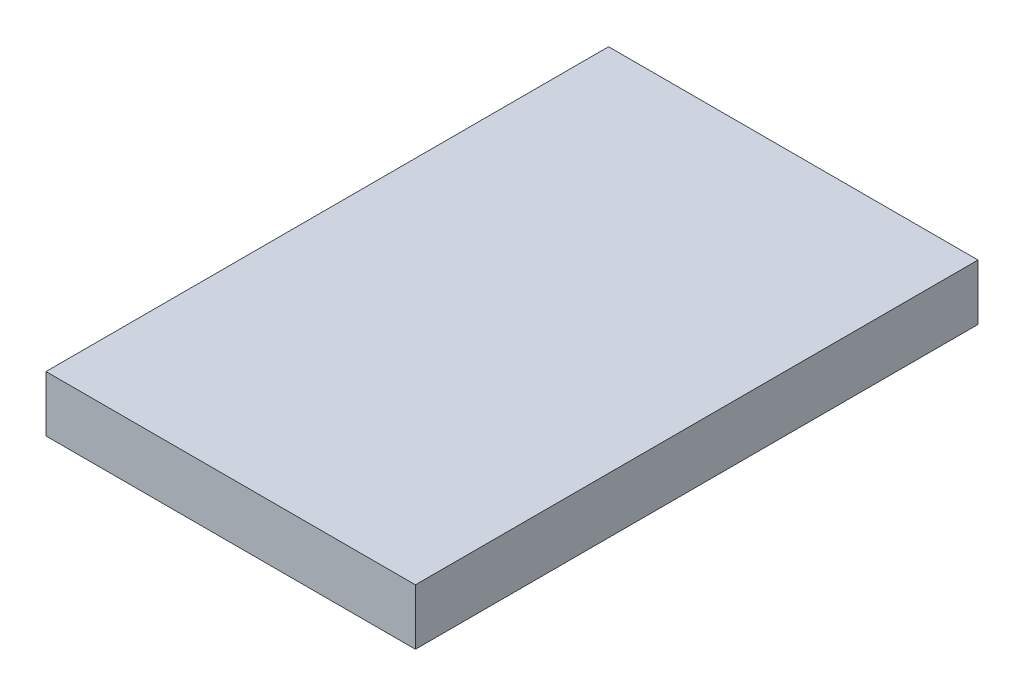
ISO-10303-21;
HEADER;
FILE_DESCRIPTION(('STEP AP214'),'2;1');
FILE_NAME('part.step','',(''),(''),'','','');
FILE_SCHEMA(('AUTOMOTIVE_DESIGN { 1 0 10303 214 1 1 1 1 }'));
ENDSEC;
DATA;
#1=APPLICATION_CONTEXT('core data for automotive mechanical design processes');
#2=APPLICATION_PROTOCOL_DEFINITION('international standard','automotive_design',2000,#1);
#3=PRODUCT_CONTEXT('',#1,'mechanical');
#4=PRODUCT('Part','Part','',(#3));
#5=PRODUCT_RELATED_PRODUCT_CATEGORY('part','',(#4));
#6=PRODUCT_DEFINITION_FORMATION('','',#4);
#7=PRODUCT_DEFINITION_CONTEXT('part definition',#1,'design');
#8=PRODUCT_DEFINITION('design','',#6,#7);
#9=PRODUCT_DEFINITION_SHAPE('','',#8);
#10=(LENGTH_UNIT() NAMED_UNIT(*) SI_UNIT(.MILLI.,.METRE.));
#11=(NAMED_UNIT(*) PLANE_ANGLE_UNIT() SI_UNIT($,.RADIAN.));
#12=(NAMED_UNIT(*) SI_UNIT($,.STERADIAN.) SOLID_ANGLE_UNIT());
#13=UNCERTAINTY_MEASURE_WITH_UNIT(LENGTH_MEASURE(1.E-05),#10,'distance_accuracy_value','');
#14=(GEOMETRIC_REPRESENTATION_CONTEXT(3) GLOBAL_UNCERTAINTY_ASSIGNED_CONTEXT((#13)) GLOBAL_UNIT_ASSIGNED_CONTEXT((#10,
#11,#12)) REPRESENTATION_CONTEXT('',''));
#15=CARTESIAN_POINT('',(0.,0.,0.));
#16=DIRECTION('',(0.,0.,1.));
#17=DIRECTION('',(1.,0.,0.));
#18=AXIS2_PLACEMENT_3D('',#15,#16,#17);
#19=CARTESIAN_POINT('',(41.5859247307322,-60.510025,-1.11333347303129));
#20=DIRECTION('',(1.,0.,0.));
#21=DIRECTION('',(0.,0.,-1.));
#22=AXIS2_PLACEMENT_3D('',#19,#20,#21);
#23=PLANE('',#22);
#24=DIRECTION('',(0.,0.,1.));
#25=VECTOR('',#24,1.);
#26=CARTESIAN_POINT('',(41.5859247307322,-23.5,0.));
#27=LINE('',#26,#25);
#28=CARTESIAN_POINT('',(41.5859247307322,-23.5,-45.));
#29=VERTEX_POINT('',#28);
#30=CARTESIAN_POINT('',(41.5859247307322,-23.5,5.38666652696871));
#31=VERTEX_POINT('',#30);
#32=EDGE_CURVE('E83',#29,#31,#27,.T.);
#33=ORIENTED_EDGE('',*,*,#32,.T.);
#34=DIRECTION('',(0.,1.,0.));
#35=VECTOR('',#34,1.);
#36=CARTESIAN_POINT('',(41.5859247307322,-60.510025,5.38666652696871));
#37=LINE('',#36,#35);
#38=CARTESIAN_POINT('',(41.5859247307322,-28.5,5.38666652696871));
#39=VERTEX_POINT('',#38);
#40=EDGE_CURVE('E11',#39,#31,#37,.T.);
#41=ORIENTED_EDGE('',*,*,#40,.F.);
#42=DIRECTION('',(0.,0.,1.));
#43=VECTOR('',#42,1.);
#44=CARTESIAN_POINT('',(41.5859247307322,-28.5,0.));
#45=LINE('',#44,#43);
#46=CARTESIAN_POINT('',(41.5859247307322,-28.5,-45.));
#47=VERTEX_POINT('',#46);
#48=EDGE_CURVE('E48',#47,#39,#45,.T.);
#49=ORIENTED_EDGE('',*,*,#48,.F.);
#50=DIRECTION('',(0.,1.,0.));
#51=VECTOR('',#50,1.);
#52=CARTESIAN_POINT('',(41.5859247307322,-60.510025,-45.));
#53=LINE('',#52,#51);
#54=EDGE_CURVE('E91',#47,#29,#53,.T.);
#55=ORIENTED_EDGE('',*,*,#54,.T.);
#56=EDGE_LOOP('',(#33,#41,#49,#55));
#57=FACE_BOUND('',#56,.T.);
#58=ADVANCED_FACE('F39',(#57),#23,.T.);
#59=CARTESIAN_POINT('',(8.5,-60.510025,5.38666652696871));
#60=DIRECTION('',(0.,0.,1.));
#61=DIRECTION('',(1.,0.,0.));
#62=AXIS2_PLACEMENT_3D('',#59,#60,#61);
#63=PLANE('',#62);
#64=DIRECTION('',(1.,0.,0.));
#65=VECTOR('',#64,1.);
#66=CARTESIAN_POINT('',(57.5,-23.5,5.38666652696871));
#67=LINE('',#66,#65);
#68=CARTESIAN_POINT('',(8.5,-23.5,5.38666652696871));
#69=VERTEX_POINT('',#68);
#70=EDGE_CURVE('E85',#69,#31,#67,.T.);
#71=ORIENTED_EDGE('',*,*,#70,.F.);
#72=DIRECTION('',(0.,1.,0.));
#73=VECTOR('',#72,1.);
#74=CARTESIAN_POINT('',(8.5,0.,5.38666652696871));
#75=LINE('',#74,#73);
#76=CARTESIAN_POINT('',(8.5,-28.5,5.38666652696871));
#77=VERTEX_POINT('',#76);
#78=EDGE_CURVE('E95',#77,#69,#75,.T.);
#79=ORIENTED_EDGE('',*,*,#78,.F.);
#80=DIRECTION('',(-1.,0.,0.));
#81=VECTOR('',#80,1.);
#82=CARTESIAN_POINT('',(0.,-28.5,5.38666652696871));
#83=LINE('',#82,#81);
#84=EDGE_CURVE('E101',#39,#77,#83,.T.);
#85=ORIENTED_EDGE('',*,*,#84,.F.);
#86=ORIENTED_EDGE('',*,*,#40,.T.);
#87=EDGE_LOOP('',(#71,#79,#85,#86));
#88=FACE_BOUND('',#87,.T.);
#89=ADVANCED_FACE('F112',(#88),#63,.T.);
#90=CARTESIAN_POINT('',(0.,-28.5,0.));
#91=DIRECTION('',(0.,-1.,0.));
#92=DIRECTION('',(0.,0.,-1.));
#93=AXIS2_PLACEMENT_3D('',#90,#91,#92);
#94=PLANE('',#93);
#95=DIRECTION('',(-1.,0.,0.));
#96=VECTOR('',#95,1.);
#97=CARTESIAN_POINT('',(57.5,-28.5,-45.));
#98=LINE('',#97,#96);
#99=CARTESIAN_POINT('',(8.5,-28.5,-45.));
#100=VERTEX_POINT('',#99);
#101=EDGE_CURVE('E64',#47,#100,#98,.T.);
#102=ORIENTED_EDGE('',*,*,#101,.F.);
#103=ORIENTED_EDGE('',*,*,#48,.T.);
#104=ORIENTED_EDGE('',*,*,#84,.T.);
#105=DIRECTION('',(0.,0.,1.));
#106=VECTOR('',#105,1.);
#107=CARTESIAN_POINT('',(8.5,-28.5,0.));
#108=LINE('',#107,#106);
#109=EDGE_CURVE('E93',#100,#77,#108,.T.);
#110=ORIENTED_EDGE('',*,*,#109,.F.);
#111=EDGE_LOOP('',(#102,#103,#104,#110));
#112=FACE_BOUND('',#111,.T.);
#113=ADVANCED_FACE('F110',(#112),#94,.T.);
#114=CARTESIAN_POINT('',(57.5,-23.5,-45.));
#115=DIRECTION('',(0.,1.,0.));
#116=DIRECTION('',(0.,0.,1.));
#117=AXIS2_PLACEMENT_3D('',#114,#115,#116);
#118=PLANE('',#117);
#119=ORIENTED_EDGE('',*,*,#32,.F.);
#120=DIRECTION('',(-1.,0.,0.));
#121=VECTOR('',#120,1.);
#122=CARTESIAN_POINT('',(57.5,-23.5,-45.));
#123=LINE('',#122,#121);
#124=CARTESIAN_POINT('',(8.5,-23.5,-45.));
#125=VERTEX_POINT('',#124);
#126=EDGE_CURVE('E56',#29,#125,#123,.T.);
#127=ORIENTED_EDGE('',*,*,#126,.T.);
#128=DIRECTION('',(0.,0.,1.));
#129=VECTOR('',#128,1.);
#130=CARTESIAN_POINT('',(8.5,-23.5,0.));
#131=LINE('',#130,#129);
#132=EDGE_CURVE('E43',#125,#69,#131,.T.);
#133=ORIENTED_EDGE('',*,*,#132,.T.);
#134=ORIENTED_EDGE('',*,*,#70,.T.);
#135=EDGE_LOOP('',(#119,#127,#133,#134));
#136=FACE_BOUND('',#135,.T.);
#137=ADVANCED_FACE('F84',(#136),#118,.T.);
#138=CARTESIAN_POINT('',(8.5,0.,0.));
#139=DIRECTION('',(-1.,0.,0.));
#140=DIRECTION('',(0.,0.,1.));
#141=AXIS2_PLACEMENT_3D('',#138,#139,#140);
#142=PLANE('',#141);
#143=ORIENTED_EDGE('',*,*,#109,.T.);
#144=ORIENTED_EDGE('',*,*,#78,.T.);
#145=ORIENTED_EDGE('',*,*,#132,.F.);
#146=DIRECTION('',(0.,1.,0.));
#147=VECTOR('',#146,1.);
#148=CARTESIAN_POINT('',(8.5,-23.5,-45.));
#149=LINE('',#148,#147);
#150=EDGE_CURVE('E89',#100,#125,#149,.T.);
#151=ORIENTED_EDGE('',*,*,#150,.F.);
#152=EDGE_LOOP('',(#143,#144,#145,#151));
#153=FACE_BOUND('',#152,.T.);
#154=ADVANCED_FACE('F113',(#153),#142,.T.);
#155=CARTESIAN_POINT('',(57.5,-23.5,-45.));
#156=DIRECTION('',(0.,0.,-1.));
#157=DIRECTION('',(-1.,0.,0.));
#158=AXIS2_PLACEMENT_3D('',#155,#156,#157);
#159=PLANE('',#158);
#160=ORIENTED_EDGE('',*,*,#54,.F.);
#161=ORIENTED_EDGE('',*,*,#101,.T.);
#162=ORIENTED_EDGE('',*,*,#150,.T.);
#163=ORIENTED_EDGE('',*,*,#126,.F.);
#164=EDGE_LOOP('',(#160,#161,#162,#163));
#165=FACE_BOUND('',#164,.T.);
#166=ADVANCED_FACE('F41',(#165),#159,.T.);
#167=CLOSED_SHELL('',(#58,#89,#113,#137,#154,#166));
#168=MANIFOLD_SOLID_BREP('B2',#167);
#169=ADVANCED_BREP_SHAPE_REPRESENTATION('',(#18,#168),#14);
#170=SHAPE_DEFINITION_REPRESENTATION(#9,#169);
ENDSEC;
END-ISO-10303-21;
